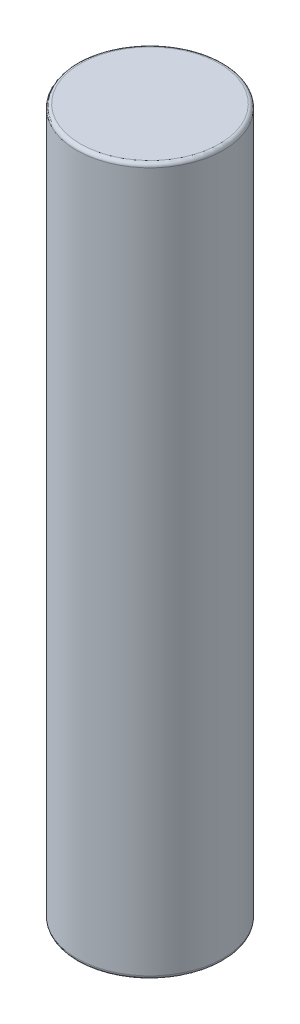
ISO-10303-21;
HEADER;
FILE_DESCRIPTION(('STEP AP214'),'2;1');
FILE_NAME('part.step','',(''),(''),'','','');
FILE_SCHEMA(('AUTOMOTIVE_DESIGN { 1 0 10303 214 1 1 1 1 }'));
ENDSEC;
DATA;
#1=APPLICATION_CONTEXT('core data for automotive mechanical design processes');
#2=APPLICATION_PROTOCOL_DEFINITION('international standard','automotive_design',2000,#1);
#3=PRODUCT_CONTEXT('',#1,'mechanical');
#4=PRODUCT('Part','Part','',(#3));
#5=PRODUCT_RELATED_PRODUCT_CATEGORY('part','',(#4));
#6=PRODUCT_DEFINITION_FORMATION('','',#4);
#7=PRODUCT_DEFINITION_CONTEXT('part definition',#1,'design');
#8=PRODUCT_DEFINITION('design','',#6,#7);
#9=PRODUCT_DEFINITION_SHAPE('','',#8);
#10=(LENGTH_UNIT() NAMED_UNIT(*) SI_UNIT(.MILLI.,.METRE.));
#11=(NAMED_UNIT(*) PLANE_ANGLE_UNIT() SI_UNIT($,.RADIAN.));
#12=(NAMED_UNIT(*) SI_UNIT($,.STERADIAN.) SOLID_ANGLE_UNIT());
#13=UNCERTAINTY_MEASURE_WITH_UNIT(LENGTH_MEASURE(1.E-05),#10,'distance_accuracy_value','');
#14=(GEOMETRIC_REPRESENTATION_CONTEXT(3) GLOBAL_UNCERTAINTY_ASSIGNED_CONTEXT((#13)) GLOBAL_UNIT_ASSIGNED_CONTEXT((#10,
#11,#12)) REPRESENTATION_CONTEXT('',''));
#15=CARTESIAN_POINT('',(0.,0.,0.));
#16=DIRECTION('',(0.,0.,1.));
#17=DIRECTION('',(1.,0.,0.));
#18=AXIS2_PLACEMENT_3D('',#15,#16,#17);
#19=CARTESIAN_POINT('',(0.,24.13,0.));
#20=DIRECTION('',(0.,-1.,0.));
#21=DIRECTION('',(0.,0.,-1.));
#22=AXIS2_PLACEMENT_3D('',#19,#20,#21);
#23=CYLINDRICAL_SURFACE('',#22,2.5);
#24=CARTESIAN_POINT('',(0.,0.126999999999999,0.));
#25=DIRECTION('',(0.,1.,0.));
#26=DIRECTION('',(0.,0.,1.));
#27=AXIS2_PLACEMENT_3D('',#24,#25,#26);
#28=CIRCLE('',#27,2.5);
#29=CARTESIAN_POINT('',(0.,0.126999999999999,-2.5));
#30=VERTEX_POINT('',#29);
#31=EDGE_CURVE('E43',#30,#30,#28,.T.);
#32=CARTESIAN_POINT('',(0.,24.003,0.));
#33=DIRECTION('',(0.,1.,0.));
#34=DIRECTION('',(0.,0.,1.));
#35=AXIS2_PLACEMENT_3D('',#32,#33,#34);
#36=CIRCLE('',#35,2.5);
#37=CARTESIAN_POINT('',(0.,24.003,-2.5));
#38=VERTEX_POINT('',#37);
#39=EDGE_CURVE('E47',#38,#38,#36,.F.);
#40=CARTESIAN_POINT('',(0.,0.126999999999999,-2.5));
#41=CARTESIAN_POINT('',(0.,0.375708333333332,-2.5));
#42=CARTESIAN_POINT('',(0.,0.624416666666666,-2.5));
#43=CARTESIAN_POINT('',(0.,1.12183333333333,-2.5));
#44=CARTESIAN_POINT('',(0.,1.37054166666667,-2.5));
#45=CARTESIAN_POINT('',(0.,1.86795833333333,-2.5));
#46=CARTESIAN_POINT('',(0.,2.11666666666667,-2.5));
#47=CARTESIAN_POINT('',(0.,2.61408333333333,-2.5));
#48=CARTESIAN_POINT('',(0.,2.86279166666667,-2.5));
#49=CARTESIAN_POINT('',(0.,3.36020833333333,-2.5));
#50=CARTESIAN_POINT('',(0.,3.60891666666667,-2.5));
#51=CARTESIAN_POINT('',(0.,4.10633333333333,-2.5));
#52=CARTESIAN_POINT('',(0.,4.35504166666667,-2.5));
#53=CARTESIAN_POINT('',(0.,4.85245833333333,-2.5));
#54=CARTESIAN_POINT('',(0.,5.10116666666667,-2.5));
#55=CARTESIAN_POINT('',(0.,5.59858333333333,-2.5));
#56=CARTESIAN_POINT('',(0.,5.84729166666667,-2.5));
#57=CARTESIAN_POINT('',(0.,6.34470833333333,-2.5));
#58=CARTESIAN_POINT('',(0.,6.59341666666667,-2.5));
#59=CARTESIAN_POINT('',(0.,7.09083333333333,-2.5));
#60=CARTESIAN_POINT('',(0.,7.33954166666667,-2.5));
#61=CARTESIAN_POINT('',(0.,7.83695833333333,-2.5));
#62=CARTESIAN_POINT('',(0.,8.08566666666667,-2.5));
#63=CARTESIAN_POINT('',(0.,8.58308333333333,-2.5));
#64=CARTESIAN_POINT('',(0.,8.83179166666666,-2.5));
#65=CARTESIAN_POINT('',(0.,9.32920833333333,-2.5));
#66=CARTESIAN_POINT('',(0.,9.57791666666666,-2.5));
#67=CARTESIAN_POINT('',(0.,10.0753333333333,-2.5));
#68=CARTESIAN_POINT('',(0.,10.3240416666667,-2.5));
#69=CARTESIAN_POINT('',(0.,10.8214583333333,-2.5));
#70=CARTESIAN_POINT('',(0.,11.0701666666667,-2.5));
#71=CARTESIAN_POINT('',(0.,11.5675833333333,-2.5));
#72=CARTESIAN_POINT('',(0.,11.8162916666667,-2.5));
#73=CARTESIAN_POINT('',(0.,12.3137083333333,-2.5));
#74=CARTESIAN_POINT('',(0.,12.5624166666667,-2.5));
#75=CARTESIAN_POINT('',(0.,13.0598333333333,-2.5));
#76=CARTESIAN_POINT('',(0.,13.3085416666667,-2.5));
#77=CARTESIAN_POINT('',(0.,13.8059583333333,-2.5));
#78=CARTESIAN_POINT('',(0.,14.0546666666667,-2.5));
#79=CARTESIAN_POINT('',(0.,14.5520833333333,-2.5));
#80=CARTESIAN_POINT('',(0.,14.8007916666667,-2.5));
#81=CARTESIAN_POINT('',(0.,15.2982083333333,-2.5));
#82=CARTESIAN_POINT('',(0.,15.5469166666667,-2.5));
#83=CARTESIAN_POINT('',(0.,16.0443333333333,-2.5));
#84=CARTESIAN_POINT('',(0.,16.2930416666667,-2.5));
#85=CARTESIAN_POINT('',(0.,16.7904583333333,-2.5));
#86=CARTESIAN_POINT('',(0.,17.0391666666667,-2.5));
#87=CARTESIAN_POINT('',(0.,17.5365833333333,-2.5));
#88=CARTESIAN_POINT('',(0.,17.7852916666667,-2.5));
#89=CARTESIAN_POINT('',(0.,18.2827083333333,-2.5));
#90=CARTESIAN_POINT('',(0.,18.5314166666667,-2.5));
#91=CARTESIAN_POINT('',(0.,19.0288333333333,-2.5));
#92=CARTESIAN_POINT('',(0.,19.2775416666667,-2.5));
#93=CARTESIAN_POINT('',(0.,19.7749583333333,-2.5));
#94=CARTESIAN_POINT('',(0.,20.0236666666667,-2.5));
#95=CARTESIAN_POINT('',(0.,20.5210833333333,-2.5));
#96=CARTESIAN_POINT('',(0.,20.7697916666667,-2.5));
#97=CARTESIAN_POINT('',(0.,21.2672083333333,-2.5));
#98=CARTESIAN_POINT('',(0.,21.5159166666667,-2.5));
#99=CARTESIAN_POINT('',(0.,22.0133333333333,-2.5));
#100=CARTESIAN_POINT('',(0.,22.2620416666667,-2.5));
#101=CARTESIAN_POINT('',(0.,22.7594583333333,-2.5));
#102=CARTESIAN_POINT('',(0.,23.0081666666667,-2.5));
#103=CARTESIAN_POINT('',(0.,23.5055833333333,-2.5));
#104=CARTESIAN_POINT('',(0.,23.7542916666667,-2.5));
#105=CARTESIAN_POINT('',(0.,24.003,-2.5));
#106=B_SPLINE_CURVE_WITH_KNOTS('',3,(#40,#41,#42,#43,#44,#45,#46,#47,#48,#49,#50,#51,#52,#53,
#54,#55,#56,#57,#58,#59,#60,#61,#62,#63,#64,#65,#66,#67,#68,#69,#70,#71,#72,#73,#74,#75,#76,#77,
#78,#79,#80,#81,#82,#83,#84,#85,#86,#87,#88,#89,#90,#91,#92,#93,#94,#95,#96,#97,#98,#99,#100,
#101,#102,#103,#104,#105),.UNSPECIFIED.,.F.,.F.,(4,2,2,2,2,2,2,2,2,2,2,2,2,2,2,2,2,2,2,2,2,2,2,
2,2,2,2,2,2,2,2,2,4),(0.,0.746125,1.49225,2.238375,2.9845,3.730625,4.47675,5.222875,5.969,
6.715125,7.46125,8.207375,8.9535,9.699625,10.44575,11.191875,11.938,12.684125,13.43025,
14.176375,14.9225,15.668625,16.41475,17.160875,17.907,18.653125,19.39925,20.145375,20.8915,
21.637625,22.38375,23.129875,23.876),.UNSPECIFIED.);
#107=EDGE_CURVE('BSEAM32',#30,#38,#106,.T.);
#108=ORIENTED_EDGE('',*,*,#31,.T.);
#109=ORIENTED_EDGE('',*,*,#39,.T.);
#110=ORIENTED_EDGE('',*,*,#107,.T.);
#111=ORIENTED_EDGE('',*,*,#107,.F.);
#112=EDGE_LOOP('',(#108,#110,#109,#111));
#113=FACE_BOUND('',#112,.T.);
#114=ADVANCED_FACE('F32',(#113),#23,.T.);
#115=CARTESIAN_POINT('',(0.,24.13,0.));
#116=DIRECTION('',(0.,1.,0.));
#117=DIRECTION('',(0.,0.,1.));
#118=AXIS2_PLACEMENT_3D('',#115,#116,#117);
#119=PLANE('',#118);
#120=CARTESIAN_POINT('',(0.,24.13,0.));
#121=DIRECTION('',(0.,1.,0.));
#122=DIRECTION('',(0.,0.,1.));
#123=AXIS2_PLACEMENT_3D('',#120,#121,#122);
#124=CIRCLE('',#123,2.373);
#125=CARTESIAN_POINT('',(0.,24.13,2.373));
#126=VERTEX_POINT('',#125);
#127=EDGE_CURVE('E10',#126,#126,#124,.T.);
#128=ORIENTED_EDGE('',*,*,#127,.T.);
#129=EDGE_LOOP('',(#128));
#130=FACE_BOUND('',#129,.T.);
#131=ADVANCED_FACE('F63',(#130),#119,.T.);
#132=CARTESIAN_POINT('',(0.,0.,0.));
#133=DIRECTION('',(0.,1.,0.));
#134=DIRECTION('',(0.,0.,1.));
#135=AXIS2_PLACEMENT_3D('',#132,#133,#134);
#136=PLANE('',#135);
#137=CARTESIAN_POINT('',(0.,0.,0.));
#138=DIRECTION('',(0.,1.,0.));
#139=DIRECTION('',(0.,0.,1.));
#140=AXIS2_PLACEMENT_3D('',#137,#138,#139);
#141=CIRCLE('',#140,2.373);
#142=CARTESIAN_POINT('',(0.,0.,2.373));
#143=VERTEX_POINT('',#142);
#144=EDGE_CURVE('E39',#143,#143,#141,.F.);
#145=ORIENTED_EDGE('',*,*,#144,.T.);
#146=EDGE_LOOP('',(#145));
#147=FACE_BOUND('',#146,.T.);
#148=ADVANCED_FACE('F60',(#147),#136,.F.);
#149=CARTESIAN_POINT('',(0.,0.126999999999999,0.));
#150=DIRECTION('',(0.,1.,0.));
#151=DIRECTION('',(0.,0.,1.));
#152=AXIS2_PLACEMENT_3D('',#149,#150,#151);
#153=TOROIDAL_SURFACE('',#152,2.373,0.127);
#154=ORIENTED_EDGE('',*,*,#144,.F.);
#155=EDGE_LOOP('',(#154));
#156=FACE_BOUND('',#155,.T.);
#157=ORIENTED_EDGE('',*,*,#31,.F.);
#158=EDGE_LOOP('',(#157));
#159=FACE_BOUND('',#158,.T.);
#160=ADVANCED_FACE('F56',(#156,#159),#153,.T.);
#161=CARTESIAN_POINT('',(0.,24.003,0.));
#162=DIRECTION('',(0.,1.,0.));
#163=DIRECTION('',(0.,0.,1.));
#164=AXIS2_PLACEMENT_3D('',#161,#162,#163);
#165=TOROIDAL_SURFACE('',#164,2.373,0.127);
#166=ORIENTED_EDGE('',*,*,#39,.F.);
#167=EDGE_LOOP('',(#166));
#168=FACE_BOUND('',#167,.T.);
#169=ORIENTED_EDGE('',*,*,#127,.F.);
#170=EDGE_LOOP('',(#169));
#171=FACE_BOUND('',#170,.T.);
#172=ADVANCED_FACE('F34',(#168,#171),#165,.T.);
#173=CLOSED_SHELL('',(#114,#131,#148,#160,#172));
#174=MANIFOLD_SOLID_BREP('B2',#173);
#175=ADVANCED_BREP_SHAPE_REPRESENTATION('',(#18,#174),#14);
#176=SHAPE_DEFINITION_REPRESENTATION(#9,#175);
ENDSEC;
END-ISO-10303-21;
